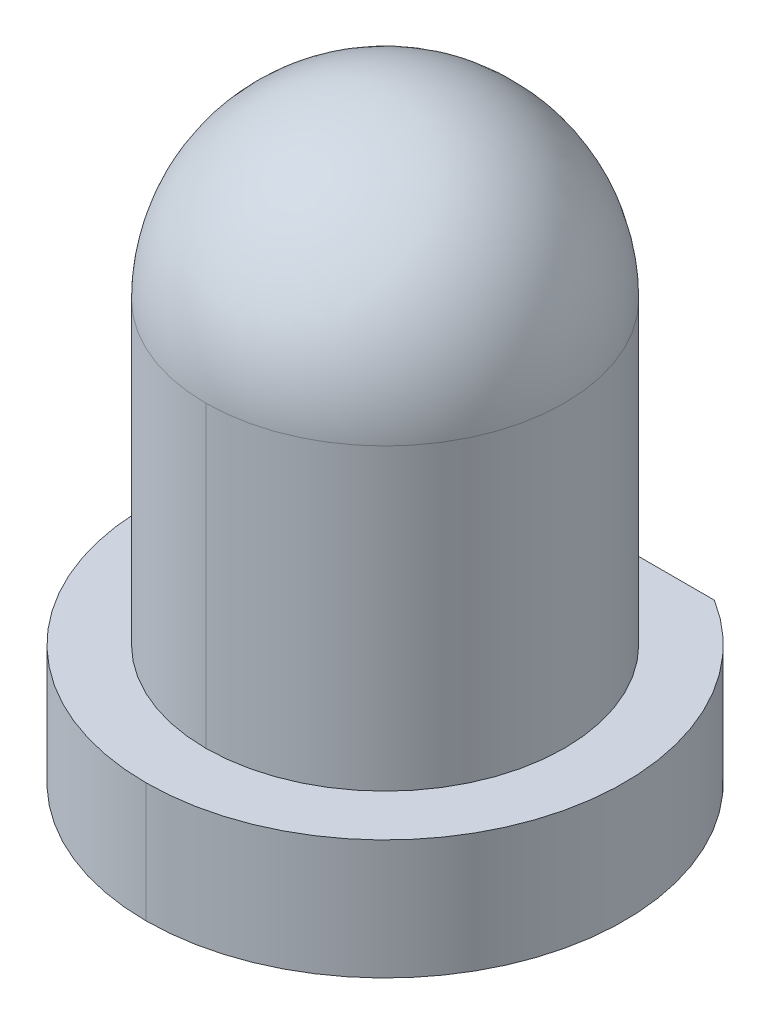
ISO-10303-21;
HEADER;
FILE_DESCRIPTION(('STEP AP214'),'2;1');
FILE_NAME('part.step','',(''),(''),'','','');
FILE_SCHEMA(('AUTOMOTIVE_DESIGN { 1 0 10303 214 1 1 1 1 }'));
ENDSEC;
DATA;
#1=APPLICATION_CONTEXT('core data for automotive mechanical design processes');
#2=APPLICATION_PROTOCOL_DEFINITION('international standard','automotive_design',2000,#1);
#3=PRODUCT_CONTEXT('',#1,'mechanical');
#4=PRODUCT('Part','Part','',(#3));
#5=PRODUCT_RELATED_PRODUCT_CATEGORY('part','',(#4));
#6=PRODUCT_DEFINITION_FORMATION('','',#4);
#7=PRODUCT_DEFINITION_CONTEXT('part definition',#1,'design');
#8=PRODUCT_DEFINITION('design','',#6,#7);
#9=PRODUCT_DEFINITION_SHAPE('','',#8);
#10=(LENGTH_UNIT() NAMED_UNIT(*) SI_UNIT(.MILLI.,.METRE.));
#11=(NAMED_UNIT(*) PLANE_ANGLE_UNIT() SI_UNIT($,.RADIAN.));
#12=(NAMED_UNIT(*) SI_UNIT($,.STERADIAN.) SOLID_ANGLE_UNIT());
#13=UNCERTAINTY_MEASURE_WITH_UNIT(LENGTH_MEASURE(1.E-05),#10,'distance_accuracy_value','');
#14=(GEOMETRIC_REPRESENTATION_CONTEXT(3) GLOBAL_UNCERTAINTY_ASSIGNED_CONTEXT((#13)) GLOBAL_UNIT_ASSIGNED_CONTEXT((#10,
#11,#12)) REPRESENTATION_CONTEXT('',''));
#15=CARTESIAN_POINT('',(0.,0.,0.));
#16=DIRECTION('',(0.,0.,1.));
#17=DIRECTION('',(1.,0.,0.));
#18=AXIS2_PLACEMENT_3D('',#15,#16,#17);
#19=CARTESIAN_POINT('',(0.,0.1,0.));
#20=DIRECTION('',(0.,-1.,0.));
#21=DIRECTION('',(0.,0.,-1.));
#22=AXIS2_PLACEMENT_3D('',#19,#20,#21);
#23=PLANE('',#22);
#24=DIRECTION('',(1.,0.,0.));
#25=VECTOR('',#24,1.);
#26=CARTESIAN_POINT('',(-1.25,0.1,-0.25));
#27=LINE('',#26,#25);
#28=CARTESIAN_POINT('',(-1.25,0.1,-0.25));
#29=VERTEX_POINT('',#28);
#30=CARTESIAN_POINT('',(-0.75,0.1,-0.25));
#31=VERTEX_POINT('',#30);
#32=EDGE_CURVE('E293',#29,#31,#27,.T.);
#33=ORIENTED_EDGE('',*,*,#32,.T.);
#34=DIRECTION('',(0.,0.,1.));
#35=VECTOR('',#34,1.);
#36=CARTESIAN_POINT('',(-0.75,0.1,-0.25));
#37=LINE('',#36,#35);
#38=CARTESIAN_POINT('',(-0.75,0.1,0.25));
#39=VERTEX_POINT('',#38);
#40=EDGE_CURVE('E266',#31,#39,#37,.T.);
#41=ORIENTED_EDGE('',*,*,#40,.T.);
#42=DIRECTION('',(-1.,0.,0.));
#43=VECTOR('',#42,1.);
#44=CARTESIAN_POINT('',(-0.75,0.1,0.25));
#45=LINE('',#44,#43);
#46=CARTESIAN_POINT('',(-1.25,0.1,0.25));
#47=VERTEX_POINT('',#46);
#48=EDGE_CURVE('E261',#39,#47,#45,.T.);
#49=ORIENTED_EDGE('',*,*,#48,.T.);
#50=DIRECTION('',(0.,0.,-1.));
#51=VECTOR('',#50,1.);
#52=CARTESIAN_POINT('',(-1.25,0.1,0.25));
#53=LINE('',#52,#51);
#54=EDGE_CURVE('E11',#47,#29,#53,.T.);
#55=ORIENTED_EDGE('',*,*,#54,.T.);
#56=EDGE_LOOP('',(#33,#41,#49,#55));
#57=FACE_BOUND('',#56,.T.);
#58=ADVANCED_FACE('F16',(#57),#23,.T.);
#59=CARTESIAN_POINT('',(0.,0.1,0.));
#60=DIRECTION('',(0.,-1.,0.));
#61=DIRECTION('',(0.,0.,-1.));
#62=AXIS2_PLACEMENT_3D('',#59,#60,#61);
#63=PLANE('',#62);
#64=DIRECTION('',(1.,0.,0.));
#65=VECTOR('',#64,1.);
#66=CARTESIAN_POINT('',(-0.25,0.1,-0.25));
#67=LINE('',#66,#65);
#68=CARTESIAN_POINT('',(-0.25,0.1,-0.25));
#69=VERTEX_POINT('',#68);
#70=CARTESIAN_POINT('',(0.25,0.1,-0.25));
#71=VERTEX_POINT('',#70);
#72=EDGE_CURVE('E310',#69,#71,#67,.T.);
#73=ORIENTED_EDGE('',*,*,#72,.T.);
#74=DIRECTION('',(0.,0.,1.));
#75=VECTOR('',#74,1.);
#76=CARTESIAN_POINT('',(0.25,0.1,-0.25));
#77=LINE('',#76,#75);
#78=CARTESIAN_POINT('',(0.25,0.1,0.25));
#79=VERTEX_POINT('',#78);
#80=EDGE_CURVE('E324',#71,#79,#77,.T.);
#81=ORIENTED_EDGE('',*,*,#80,.T.);
#82=DIRECTION('',(-1.,0.,0.));
#83=VECTOR('',#82,1.);
#84=CARTESIAN_POINT('',(0.25,0.1,0.25));
#85=LINE('',#84,#83);
#86=CARTESIAN_POINT('',(-0.25,0.1,0.25));
#87=VERTEX_POINT('',#86);
#88=EDGE_CURVE('E259',#79,#87,#85,.T.);
#89=ORIENTED_EDGE('',*,*,#88,.T.);
#90=DIRECTION('',(0.,0.,-1.));
#91=VECTOR('',#90,1.);
#92=CARTESIAN_POINT('',(-0.25,0.1,0.25));
#93=LINE('',#92,#91);
#94=EDGE_CURVE('E322',#87,#69,#93,.T.);
#95=ORIENTED_EDGE('',*,*,#94,.T.);
#96=EDGE_LOOP('',(#73,#81,#89,#95));
#97=FACE_BOUND('',#96,.T.);
#98=ADVANCED_FACE('F509',(#97),#63,.T.);
#99=CARTESIAN_POINT('',(0.,0.1,0.));
#100=DIRECTION('',(0.,-1.,0.));
#101=DIRECTION('',(0.,0.,-1.));
#102=AXIS2_PLACEMENT_3D('',#99,#100,#101);
#103=PLANE('',#102);
#104=DIRECTION('',(1.,0.,0.));
#105=VECTOR('',#104,1.);
#106=CARTESIAN_POINT('',(0.75,0.1,-0.25));
#107=LINE('',#106,#105);
#108=CARTESIAN_POINT('',(0.75,0.1,-0.25));
#109=VERTEX_POINT('',#108);
#110=CARTESIAN_POINT('',(1.25,0.1,-0.25));
#111=VERTEX_POINT('',#110);
#112=EDGE_CURVE('E210',#109,#111,#107,.T.);
#113=ORIENTED_EDGE('',*,*,#112,.T.);
#114=DIRECTION('',(0.,0.,1.));
#115=VECTOR('',#114,1.);
#116=CARTESIAN_POINT('',(1.25,0.1,-0.25));
#117=LINE('',#116,#115);
#118=CARTESIAN_POINT('',(1.25,0.1,0.25));
#119=VERTEX_POINT('',#118);
#120=EDGE_CURVE('E291',#111,#119,#117,.T.);
#121=ORIENTED_EDGE('',*,*,#120,.T.);
#122=DIRECTION('',(-1.,0.,0.));
#123=VECTOR('',#122,1.);
#124=CARTESIAN_POINT('',(1.25,0.1,0.25));
#125=LINE('',#124,#123);
#126=CARTESIAN_POINT('',(0.75,0.1,0.25));
#127=VERTEX_POINT('',#126);
#128=EDGE_CURVE('E292',#119,#127,#125,.T.);
#129=ORIENTED_EDGE('',*,*,#128,.T.);
#130=DIRECTION('',(0.,0.,-1.));
#131=VECTOR('',#130,1.);
#132=CARTESIAN_POINT('',(0.75,0.1,0.25));
#133=LINE('',#132,#131);
#134=EDGE_CURVE('E260',#127,#109,#133,.T.);
#135=ORIENTED_EDGE('',*,*,#134,.T.);
#136=EDGE_LOOP('',(#113,#121,#129,#135));
#137=FACE_BOUND('',#136,.T.);
#138=ADVANCED_FACE('F500',(#137),#103,.T.);
#139=CARTESIAN_POINT('',(-1.25,0.1,0.25));
#140=DIRECTION('',(-1.,0.,0.));
#141=DIRECTION('',(0.,0.,1.));
#142=AXIS2_PLACEMENT_3D('',#139,#140,#141);
#143=PLANE('',#142);
#144=DIRECTION('',(0.,1.,0.));
#145=VECTOR('',#144,1.);
#146=CARTESIAN_POINT('',(-1.25,0.1,-0.25));
#147=LINE('',#146,#145);
#148=CARTESIAN_POINT('',(-1.25,0.,-0.25));
#149=VERTEX_POINT('',#148);
#150=EDGE_CURVE('E26',#149,#29,#147,.T.);
#151=ORIENTED_EDGE('',*,*,#150,.T.);
#152=ORIENTED_EDGE('',*,*,#54,.F.);
#153=DIRECTION('',(0.,-1.,0.));
#154=VECTOR('',#153,1.);
#155=CARTESIAN_POINT('',(-1.25,0.1,0.25));
#156=LINE('',#155,#154);
#157=CARTESIAN_POINT('',(-1.25,0.,0.25));
#158=VERTEX_POINT('',#157);
#159=EDGE_CURVE('E265',#47,#158,#156,.T.);
#160=ORIENTED_EDGE('',*,*,#159,.T.);
#161=DIRECTION('',(0.,0.,-1.));
#162=VECTOR('',#161,1.);
#163=CARTESIAN_POINT('',(-1.25,0.,0.));
#164=LINE('',#163,#162);
#165=EDGE_CURVE('E270',#158,#149,#164,.T.);
#166=ORIENTED_EDGE('',*,*,#165,.T.);
#167=EDGE_LOOP('',(#151,#152,#160,#166));
#168=FACE_BOUND('',#167,.T.);
#169=ADVANCED_FACE('F385',(#168),#143,.F.);
#170=CARTESIAN_POINT('',(-1.25,0.1,-0.25));
#171=DIRECTION('',(0.,0.,-1.));
#172=DIRECTION('',(0.,-1.,0.));
#173=AXIS2_PLACEMENT_3D('',#170,#171,#172);
#174=PLANE('',#173);
#175=DIRECTION('',(0.,1.,0.));
#176=VECTOR('',#175,1.);
#177=CARTESIAN_POINT('',(-0.75,0.1,-0.25));
#178=LINE('',#177,#176);
#179=CARTESIAN_POINT('',(-0.75,0.,-0.25));
#180=VERTEX_POINT('',#179);
#181=EDGE_CURVE('E269',#180,#31,#178,.T.);
#182=ORIENTED_EDGE('',*,*,#181,.T.);
#183=ORIENTED_EDGE('',*,*,#32,.F.);
#184=ORIENTED_EDGE('',*,*,#150,.F.);
#185=DIRECTION('',(1.,0.,0.));
#186=VECTOR('',#185,1.);
#187=CARTESIAN_POINT('',(0.,0.,-0.25));
#188=LINE('',#187,#186);
#189=EDGE_CURVE('E275',#149,#180,#188,.T.);
#190=ORIENTED_EDGE('',*,*,#189,.T.);
#191=EDGE_LOOP('',(#182,#183,#184,#190));
#192=FACE_BOUND('',#191,.T.);
#193=ADVANCED_FACE('F397',(#192),#174,.F.);
#194=CARTESIAN_POINT('',(-0.75,0.1,-0.25));
#195=DIRECTION('',(1.,0.,0.));
#196=DIRECTION('',(0.,1.,0.));
#197=AXIS2_PLACEMENT_3D('',#194,#195,#196);
#198=PLANE('',#197);
#199=DIRECTION('',(0.,1.,0.));
#200=VECTOR('',#199,1.);
#201=CARTESIAN_POINT('',(-0.75,0.1,0.25));
#202=LINE('',#201,#200);
#203=CARTESIAN_POINT('',(-0.75,0.,0.25));
#204=VERTEX_POINT('',#203);
#205=EDGE_CURVE('E264',#204,#39,#202,.T.);
#206=ORIENTED_EDGE('',*,*,#205,.T.);
#207=ORIENTED_EDGE('',*,*,#40,.F.);
#208=ORIENTED_EDGE('',*,*,#181,.F.);
#209=DIRECTION('',(0.,0.,1.));
#210=VECTOR('',#209,1.);
#211=CARTESIAN_POINT('',(-0.75,0.,0.));
#212=LINE('',#211,#210);
#213=EDGE_CURVE('E296',#180,#204,#212,.T.);
#214=ORIENTED_EDGE('',*,*,#213,.T.);
#215=EDGE_LOOP('',(#206,#207,#208,#214));
#216=FACE_BOUND('',#215,.T.);
#217=ADVANCED_FACE('F570',(#216),#198,.F.);
#218=CARTESIAN_POINT('',(-0.75,0.1,0.25));
#219=DIRECTION('',(0.,0.,1.));
#220=DIRECTION('',(1.,0.,0.));
#221=AXIS2_PLACEMENT_3D('',#218,#219,#220);
#222=PLANE('',#221);
#223=ORIENTED_EDGE('',*,*,#159,.F.);
#224=ORIENTED_EDGE('',*,*,#48,.F.);
#225=ORIENTED_EDGE('',*,*,#205,.F.);
#226=DIRECTION('',(-1.,0.,0.));
#227=VECTOR('',#226,1.);
#228=CARTESIAN_POINT('',(0.,0.,0.25));
#229=LINE('',#228,#227);
#230=EDGE_CURVE('E274',#204,#158,#229,.T.);
#231=ORIENTED_EDGE('',*,*,#230,.T.);
#232=EDGE_LOOP('',(#223,#224,#225,#231));
#233=FACE_BOUND('',#232,.T.);
#234=ADVANCED_FACE('F391',(#233),#222,.F.);
#235=CARTESIAN_POINT('',(-0.25,0.1,0.25));
#236=DIRECTION('',(-1.,0.,0.));
#237=DIRECTION('',(0.,0.,1.));
#238=AXIS2_PLACEMENT_3D('',#235,#236,#237);
#239=PLANE('',#238);
#240=DIRECTION('',(0.,1.,0.));
#241=VECTOR('',#240,1.);
#242=CARTESIAN_POINT('',(-0.25,0.1,-0.25));
#243=LINE('',#242,#241);
#244=CARTESIAN_POINT('',(-0.25,0.,-0.25));
#245=VERTEX_POINT('',#244);
#246=EDGE_CURVE('E312',#245,#69,#243,.T.);
#247=ORIENTED_EDGE('',*,*,#246,.T.);
#248=ORIENTED_EDGE('',*,*,#94,.F.);
#249=DIRECTION('',(0.,-1.,0.));
#250=VECTOR('',#249,1.);
#251=CARTESIAN_POINT('',(-0.25,0.1,0.25));
#252=LINE('',#251,#250);
#253=CARTESIAN_POINT('',(-0.25,0.,0.25));
#254=VERTEX_POINT('',#253);
#255=EDGE_CURVE('E256',#87,#254,#252,.T.);
#256=ORIENTED_EDGE('',*,*,#255,.T.);
#257=DIRECTION('',(0.,0.,-1.));
#258=VECTOR('',#257,1.);
#259=CARTESIAN_POINT('',(-0.25,0.,0.));
#260=LINE('',#259,#258);
#261=EDGE_CURVE('E377',#254,#245,#260,.T.);
#262=ORIENTED_EDGE('',*,*,#261,.T.);
#263=EDGE_LOOP('',(#247,#248,#256,#262));
#264=FACE_BOUND('',#263,.T.);
#265=ADVANCED_FACE('F18',(#264),#239,.F.);
#266=CARTESIAN_POINT('',(-0.25,0.1,-0.25));
#267=DIRECTION('',(0.,0.,-1.));
#268=DIRECTION('',(0.,-1.,0.));
#269=AXIS2_PLACEMENT_3D('',#266,#267,#268);
#270=PLANE('',#269);
#271=DIRECTION('',(0.,1.,0.));
#272=VECTOR('',#271,1.);
#273=CARTESIAN_POINT('',(0.25,0.1,-0.25));
#274=LINE('',#273,#272);
#275=CARTESIAN_POINT('',(0.25,0.,-0.25));
#276=VERTEX_POINT('',#275);
#277=EDGE_CURVE('E313',#276,#71,#274,.T.);
#278=ORIENTED_EDGE('',*,*,#277,.T.);
#279=ORIENTED_EDGE('',*,*,#72,.F.);
#280=ORIENTED_EDGE('',*,*,#246,.F.);
#281=DIRECTION('',(1.,0.,0.));
#282=VECTOR('',#281,1.);
#283=CARTESIAN_POINT('',(0.,0.,-0.25));
#284=LINE('',#283,#282);
#285=EDGE_CURVE('E286',#245,#276,#284,.T.);
#286=ORIENTED_EDGE('',*,*,#285,.T.);
#287=EDGE_LOOP('',(#278,#279,#280,#286));
#288=FACE_BOUND('',#287,.T.);
#289=ADVANCED_FACE('F612',(#288),#270,.F.);
#290=CARTESIAN_POINT('',(0.25,0.1,-0.25));
#291=DIRECTION('',(1.,0.,0.));
#292=DIRECTION('',(0.,1.,0.));
#293=AXIS2_PLACEMENT_3D('',#290,#291,#292);
#294=PLANE('',#293);
#295=DIRECTION('',(0.,1.,0.));
#296=VECTOR('',#295,1.);
#297=CARTESIAN_POINT('',(0.25,0.1,0.25));
#298=LINE('',#297,#296);
#299=CARTESIAN_POINT('',(0.25,0.,0.25));
#300=VERTEX_POINT('',#299);
#301=EDGE_CURVE('E309',#300,#79,#298,.T.);
#302=ORIENTED_EDGE('',*,*,#301,.T.);
#303=ORIENTED_EDGE('',*,*,#80,.F.);
#304=ORIENTED_EDGE('',*,*,#277,.F.);
#305=DIRECTION('',(0.,0.,1.));
#306=VECTOR('',#305,1.);
#307=CARTESIAN_POINT('',(0.25,0.,0.));
#308=LINE('',#307,#306);
#309=EDGE_CURVE('E279',#276,#300,#308,.T.);
#310=ORIENTED_EDGE('',*,*,#309,.T.);
#311=EDGE_LOOP('',(#302,#303,#304,#310));
#312=FACE_BOUND('',#311,.T.);
#313=ADVANCED_FACE('F541',(#312),#294,.F.);
#314=CARTESIAN_POINT('',(0.25,0.1,0.25));
#315=DIRECTION('',(0.,0.,1.));
#316=DIRECTION('',(1.,0.,0.));
#317=AXIS2_PLACEMENT_3D('',#314,#315,#316);
#318=PLANE('',#317);
#319=ORIENTED_EDGE('',*,*,#255,.F.);
#320=ORIENTED_EDGE('',*,*,#88,.F.);
#321=ORIENTED_EDGE('',*,*,#301,.F.);
#322=DIRECTION('',(-1.,0.,0.));
#323=VECTOR('',#322,1.);
#324=CARTESIAN_POINT('',(0.,0.,0.25));
#325=LINE('',#324,#323);
#326=EDGE_CURVE('E249',#300,#254,#325,.T.);
#327=ORIENTED_EDGE('',*,*,#326,.T.);
#328=EDGE_LOOP('',(#319,#320,#321,#327));
#329=FACE_BOUND('',#328,.T.);
#330=ADVANCED_FACE('F535',(#329),#318,.F.);
#331=CARTESIAN_POINT('',(0.75,0.1,0.25));
#332=DIRECTION('',(-1.,0.,0.));
#333=DIRECTION('',(0.,0.,1.));
#334=AXIS2_PLACEMENT_3D('',#331,#332,#333);
#335=PLANE('',#334);
#336=DIRECTION('',(0.,1.,0.));
#337=VECTOR('',#336,1.);
#338=CARTESIAN_POINT('',(0.75,0.1,-0.25));
#339=LINE('',#338,#337);
#340=CARTESIAN_POINT('',(0.75,0.,-0.25));
#341=VERTEX_POINT('',#340);
#342=EDGE_CURVE('E213',#341,#109,#339,.T.);
#343=ORIENTED_EDGE('',*,*,#342,.T.);
#344=ORIENTED_EDGE('',*,*,#134,.F.);
#345=DIRECTION('',(0.,-1.,0.));
#346=VECTOR('',#345,1.);
#347=CARTESIAN_POINT('',(0.75,0.1,0.25));
#348=LINE('',#347,#346);
#349=CARTESIAN_POINT('',(0.75,0.,0.25));
#350=VERTEX_POINT('',#349);
#351=EDGE_CURVE('E302',#127,#350,#348,.T.);
#352=ORIENTED_EDGE('',*,*,#351,.T.);
#353=DIRECTION('',(0.,0.,-1.));
#354=VECTOR('',#353,1.);
#355=CARTESIAN_POINT('',(0.75,0.,0.));
#356=LINE('',#355,#354);
#357=EDGE_CURVE('E221',#350,#341,#356,.T.);
#358=ORIENTED_EDGE('',*,*,#357,.T.);
#359=EDGE_LOOP('',(#343,#344,#352,#358));
#360=FACE_BOUND('',#359,.T.);
#361=ADVANCED_FACE('F540',(#360),#335,.F.);
#362=CARTESIAN_POINT('',(0.75,0.1,-0.25));
#363=DIRECTION('',(0.,0.,-1.));
#364=DIRECTION('',(0.,-1.,0.));
#365=AXIS2_PLACEMENT_3D('',#362,#363,#364);
#366=PLANE('',#365);
#367=DIRECTION('',(0.,1.,0.));
#368=VECTOR('',#367,1.);
#369=CARTESIAN_POINT('',(1.25,0.1,-0.25));
#370=LINE('',#369,#368);
#371=CARTESIAN_POINT('',(1.25,0.,-0.25));
#372=VERTEX_POINT('',#371);
#373=EDGE_CURVE('E214',#372,#111,#370,.T.);
#374=ORIENTED_EDGE('',*,*,#373,.T.);
#375=ORIENTED_EDGE('',*,*,#112,.F.);
#376=ORIENTED_EDGE('',*,*,#342,.F.);
#377=DIRECTION('',(1.,0.,0.));
#378=VECTOR('',#377,1.);
#379=CARTESIAN_POINT('',(0.,0.,-0.25));
#380=LINE('',#379,#378);
#381=EDGE_CURVE('E225',#341,#372,#380,.T.);
#382=ORIENTED_EDGE('',*,*,#381,.T.);
#383=EDGE_LOOP('',(#374,#375,#376,#382));
#384=FACE_BOUND('',#383,.T.);
#385=ADVANCED_FACE('F592',(#384),#366,.F.);
#386=CARTESIAN_POINT('',(1.25,0.1,-0.25));
#387=DIRECTION('',(1.,0.,0.));
#388=DIRECTION('',(0.,1.,0.));
#389=AXIS2_PLACEMENT_3D('',#386,#387,#388);
#390=PLANE('',#389);
#391=DIRECTION('',(0.,1.,0.));
#392=VECTOR('',#391,1.);
#393=CARTESIAN_POINT('',(1.25,0.1,0.25));
#394=LINE('',#393,#392);
#395=CARTESIAN_POINT('',(1.25,0.,0.25));
#396=VERTEX_POINT('',#395);
#397=EDGE_CURVE('E287',#396,#119,#394,.T.);
#398=ORIENTED_EDGE('',*,*,#397,.T.);
#399=ORIENTED_EDGE('',*,*,#120,.F.);
#400=ORIENTED_EDGE('',*,*,#373,.F.);
#401=DIRECTION('',(0.,0.,1.));
#402=VECTOR('',#401,1.);
#403=CARTESIAN_POINT('',(1.25,0.,0.));
#404=LINE('',#403,#402);
#405=EDGE_CURVE('E238',#372,#396,#404,.T.);
#406=ORIENTED_EDGE('',*,*,#405,.T.);
#407=EDGE_LOOP('',(#398,#399,#400,#406));
#408=FACE_BOUND('',#407,.T.);
#409=ADVANCED_FACE('F553',(#408),#390,.F.);
#410=CARTESIAN_POINT('',(1.25,0.1,0.25));
#411=DIRECTION('',(0.,0.,1.));
#412=DIRECTION('',(1.,0.,0.));
#413=AXIS2_PLACEMENT_3D('',#410,#411,#412);
#414=PLANE('',#413);
#415=ORIENTED_EDGE('',*,*,#351,.F.);
#416=ORIENTED_EDGE('',*,*,#128,.F.);
#417=ORIENTED_EDGE('',*,*,#397,.F.);
#418=DIRECTION('',(-1.,0.,0.));
#419=VECTOR('',#418,1.);
#420=CARTESIAN_POINT('',(0.,0.,0.25));
#421=LINE('',#420,#419);
#422=EDGE_CURVE('E224',#396,#350,#421,.T.);
#423=ORIENTED_EDGE('',*,*,#422,.T.);
#424=EDGE_LOOP('',(#415,#416,#417,#423));
#425=FACE_BOUND('',#424,.T.);
#426=ADVANCED_FACE('F548',(#425),#414,.F.);
#427=CARTESIAN_POINT('',(0.,0.,0.));
#428=DIRECTION('',(0.,1.,0.));
#429=DIRECTION('',(1.,0.,0.));
#430=AXIS2_PLACEMENT_3D('',#427,#428,#429);
#431=PLANE('',#430);
#432=CARTESIAN_POINT('',(0.,0.,0.));
#433=DIRECTION('',(0.,1.,0.));
#434=DIRECTION('',(0.,0.,1.));
#435=AXIS2_PLACEMENT_3D('',#432,#433,#434);
#436=CIRCLE('',#435,2.);
#437=CARTESIAN_POINT('',(-1.053565375285,0.,-1.7));
#438=VERTEX_POINT('',#437);
#439=CARTESIAN_POINT('',(0.,0.,2.));
#440=VERTEX_POINT('',#439);
#441=EDGE_CURVE('E255',#438,#440,#436,.T.);
#442=ORIENTED_EDGE('',*,*,#441,.F.);
#443=DIRECTION('',(1.,0.,0.));
#444=VECTOR('',#443,1.);
#445=CARTESIAN_POINT('',(-1.053565375285,0.,-1.7));
#446=LINE('',#445,#444);
#447=CARTESIAN_POINT('',(1.053565375285,0.,-1.7));
#448=VERTEX_POINT('',#447);
#449=EDGE_CURVE('E228',#438,#448,#446,.T.);
#450=ORIENTED_EDGE('',*,*,#449,.T.);
#451=CARTESIAN_POINT('',(0.,0.,0.));
#452=DIRECTION('',(0.,1.,0.));
#453=DIRECTION('',(0.,0.,1.));
#454=AXIS2_PLACEMENT_3D('',#451,#452,#453);
#455=CIRCLE('',#454,2.);
#456=EDGE_CURVE('E229',#440,#448,#455,.T.);
#457=ORIENTED_EDGE('',*,*,#456,.F.);
#458=EDGE_LOOP('',(#442,#450,#457));
#459=FACE_BOUND('',#458,.T.);
#460=ORIENTED_EDGE('',*,*,#213,.F.);
#461=ORIENTED_EDGE('',*,*,#189,.F.);
#462=ORIENTED_EDGE('',*,*,#165,.F.);
#463=ORIENTED_EDGE('',*,*,#230,.F.);
#464=EDGE_LOOP('',(#460,#461,#462,#463));
#465=FACE_BOUND('',#464,.T.);
#466=ORIENTED_EDGE('',*,*,#309,.F.);
#467=ORIENTED_EDGE('',*,*,#285,.F.);
#468=ORIENTED_EDGE('',*,*,#261,.F.);
#469=ORIENTED_EDGE('',*,*,#326,.F.);
#470=EDGE_LOOP('',(#466,#467,#468,#469));
#471=FACE_BOUND('',#470,.T.);
#472=ORIENTED_EDGE('',*,*,#405,.F.);
#473=ORIENTED_EDGE('',*,*,#381,.F.);
#474=ORIENTED_EDGE('',*,*,#357,.F.);
#475=ORIENTED_EDGE('',*,*,#422,.F.);
#476=EDGE_LOOP('',(#472,#473,#474,#475));
#477=FACE_BOUND('',#476,.T.);
#478=ADVANCED_FACE('F394',(#459,#465,#471,#477),#431,.F.);
#479=CARTESIAN_POINT('',(-1.053565375285,-2.,-1.7));
#480=DIRECTION('',(0.,0.,1.));
#481=DIRECTION('',(1.,0.,0.));
#482=AXIS2_PLACEMENT_3D('',#479,#480,#481);
#483=PLANE('',#482);
#484=DIRECTION('',(0.,1.,0.));
#485=VECTOR('',#484,1.);
#486=CARTESIAN_POINT('',(1.053565375285,0.,-1.7));
#487=LINE('',#486,#485);
#488=CARTESIAN_POINT('',(1.053565375285,1.,-1.7));
#489=VERTEX_POINT('',#488);
#490=EDGE_CURVE('E226',#448,#489,#487,.T.);
#491=ORIENTED_EDGE('',*,*,#490,.F.);
#492=ORIENTED_EDGE('',*,*,#449,.F.);
#493=DIRECTION('',(0.,-1.,0.));
#494=VECTOR('',#493,1.);
#495=CARTESIAN_POINT('',(-1.053565375285,0.,-1.7));
#496=LINE('',#495,#494);
#497=CARTESIAN_POINT('',(-1.053565375285,1.,-1.7));
#498=VERTEX_POINT('',#497);
#499=EDGE_CURVE('E215',#498,#438,#496,.T.);
#500=ORIENTED_EDGE('',*,*,#499,.F.);
#501=DIRECTION('',(-1.,0.,0.));
#502=VECTOR('',#501,1.);
#503=CARTESIAN_POINT('',(0.,1.,-1.7));
#504=LINE('',#503,#502);
#505=EDGE_CURVE('E186',#489,#498,#504,.T.);
#506=ORIENTED_EDGE('',*,*,#505,.F.);
#507=EDGE_LOOP('',(#491,#492,#500,#506));
#508=FACE_BOUND('',#507,.T.);
#509=ADVANCED_FACE('F530',(#508),#483,.F.);
#510=CARTESIAN_POINT('',(0.,0.,0.));
#511=DIRECTION('',(0.,1.,0.));
#512=DIRECTION('',(0.,0.,1.));
#513=AXIS2_PLACEMENT_3D('',#510,#511,#512);
#514=CYLINDRICAL_SURFACE('',#513,2.);
#515=DIRECTION('',(0.,1.,0.));
#516=VECTOR('',#515,1.);
#517=CARTESIAN_POINT('',(0.,0.,2.));
#518=LINE('',#517,#516);
#519=CARTESIAN_POINT('',(0.,1.,2.));
#520=VERTEX_POINT('',#519);
#521=EDGE_CURVE('E251',#440,#520,#518,.T.);
#522=ORIENTED_EDGE('',*,*,#521,.F.);
#523=ORIENTED_EDGE('',*,*,#456,.T.);
#524=ORIENTED_EDGE('',*,*,#490,.T.);
#525=CARTESIAN_POINT('',(0.,1.,0.));
#526=DIRECTION('',(0.,1.,0.));
#527=DIRECTION('',(0.,0.,1.));
#528=AXIS2_PLACEMENT_3D('',#525,#526,#527);
#529=CIRCLE('',#528,2.);
#530=EDGE_CURVE('E240',#520,#489,#529,.T.);
#531=ORIENTED_EDGE('',*,*,#530,.F.);
#532=EDGE_LOOP('',(#522,#523,#524,#531));
#533=FACE_BOUND('',#532,.T.);
#534=ADVANCED_FACE('F525',(#533),#514,.T.);
#535=CARTESIAN_POINT('',(1.5,3.5,0.));
#536=CARTESIAN_POINT('',(1.5,3.5,0.));
#537=CARTESIAN_POINT('',(1.5,3.5,0.));
#538=CARTESIAN_POINT('',(1.5,3.5,0.));
#539=CARTESIAN_POINT('',(1.5,3.5,-3.));
#540=CARTESIAN_POINT('',(1.5,9.5,-3.));
#541=CARTESIAN_POINT('',(1.5,9.5,3.));
#542=CARTESIAN_POINT('',(1.5,3.5,3.));
#543=CARTESIAN_POINT('',(-1.5,3.5,-3.));
#544=CARTESIAN_POINT('',(-1.5,9.5,-3.));
#545=CARTESIAN_POINT('',(-1.5,9.5,3.));
#546=CARTESIAN_POINT('',(-1.5,3.5,3.));
#547=CARTESIAN_POINT('',(-1.5,3.5,0.));
#548=CARTESIAN_POINT('',(-1.5,3.5,0.));
#549=CARTESIAN_POINT('',(-1.5,3.5,0.));
#550=CARTESIAN_POINT('',(-1.5,3.5,0.));
#551=(BOUNDED_SURFACE() B_SPLINE_SURFACE(3,3,((#535,#536,#537,#538),(#539,#540,#541,#542),(#543,
#544,#545,#546),(#547,#548,#549,#550)),.UNSPECIFIED.,.F.,.F.,
.F.) B_SPLINE_SURFACE_WITH_KNOTS((4,4),(4,4),(0.,1.),(0.,1.),
.UNSPECIFIED.) GEOMETRIC_REPRESENTATION_ITEM() RATIONAL_B_SPLINE_SURFACE(((1.,0.333333333333,
0.333333333333,1.),(0.333333333333,0.111111111111,0.111111111111,0.333333333333),
(0.333333333333,0.111111111111,0.111111111111,0.333333333333),(1.,0.333333333333,0.333333333333,1.))) REPRESENTATION_ITEM('') SURFACE());
#552=CARTESIAN_POINT('',(0.,3.5,0.));
#553=DIRECTION('',(0.,-1.,0.));
#554=DIRECTION('',(0.,0.,1.));
#555=AXIS2_PLACEMENT_3D('',#552,#553,#554);
#556=CIRCLE('',#555,1.5);
#557=CARTESIAN_POINT('',(-1.5,3.5,0.));
#558=VERTEX_POINT('',#557);
#559=CARTESIAN_POINT('',(0.,3.5,-1.5));
#560=VERTEX_POINT('',#559);
#561=EDGE_CURVE('E175',#558,#560,#556,.T.);
#562=CARTESIAN_POINT('',(0.,3.5,0.));
#563=DIRECTION('',(0.,-1.,0.));
#564=DIRECTION('',(0.,0.,1.));
#565=AXIS2_PLACEMENT_3D('',#562,#563,#564);
#566=CIRCLE('',#565,1.5);
#567=CARTESIAN_POINT('',(0.,3.5,1.5));
#568=VERTEX_POINT('',#567);
#569=EDGE_CURVE('E183',#568,#558,#566,.T.);
#570=CARTESIAN_POINT('',(0.,3.5,0.));
#571=DIRECTION('',(0.,-1.,0.));
#572=DIRECTION('',(0.,0.,1.));
#573=AXIS2_PLACEMENT_3D('',#570,#571,#572);
#574=CIRCLE('',#573,1.5);
#575=CARTESIAN_POINT('',(1.5,3.5,0.));
#576=VERTEX_POINT('',#575);
#577=EDGE_CURVE('E192',#576,#568,#574,.T.);
#578=CARTESIAN_POINT('',(0.,3.5,0.));
#579=DIRECTION('',(0.,-1.,0.));
#580=DIRECTION('',(0.,0.,1.));
#581=AXIS2_PLACEMENT_3D('',#578,#579,#580);
#582=CIRCLE('',#581,1.5);
#583=EDGE_CURVE('E189',#560,#576,#582,.T.);
#584=ORIENTED_EDGE('',*,*,#561,.F.);
#585=ORIENTED_EDGE('',*,*,#569,.F.);
#586=ORIENTED_EDGE('',*,*,#577,.F.);
#587=ORIENTED_EDGE('',*,*,#583,.F.);
#588=EDGE_LOOP('',(#584,#585,#586,#587));
#589=FACE_BOUND('',#588,.T.);
#590=ADVANCED_FACE('F190',(#589),#551,.T.);
#591=CARTESIAN_POINT('',(0.,1.,0.));
#592=DIRECTION('',(0.,1.,0.));
#593=DIRECTION('',(1.,0.,0.));
#594=AXIS2_PLACEMENT_3D('',#591,#592,#593);
#595=PLANE('',#594);
#596=ORIENTED_EDGE('',*,*,#505,.T.);
#597=CARTESIAN_POINT('',(0.,1.,0.));
#598=DIRECTION('',(0.,1.,0.));
#599=DIRECTION('',(0.,0.,1.));
#600=AXIS2_PLACEMENT_3D('',#597,#598,#599);
#601=CIRCLE('',#600,2.);
#602=EDGE_CURVE('E220',#498,#520,#601,.T.);
#603=ORIENTED_EDGE('',*,*,#602,.T.);
#604=ORIENTED_EDGE('',*,*,#530,.T.);
#605=EDGE_LOOP('',(#596,#603,#604));
#606=FACE_BOUND('',#605,.T.);
#607=CARTESIAN_POINT('',(0.,1.,0.));
#608=DIRECTION('',(0.,1.,0.));
#609=DIRECTION('',(0.,0.,1.));
#610=AXIS2_PLACEMENT_3D('',#607,#608,#609);
#611=CIRCLE('',#610,1.5);
#612=CARTESIAN_POINT('',(0.,1.,1.5));
#613=VERTEX_POINT('',#612);
#614=CARTESIAN_POINT('',(0.,1.,-1.5));
#615=VERTEX_POINT('',#614);
#616=EDGE_CURVE('E199',#613,#615,#611,.T.);
#617=ORIENTED_EDGE('',*,*,#616,.F.);
#618=CARTESIAN_POINT('',(0.,1.,0.));
#619=DIRECTION('',(0.,1.,0.));
#620=DIRECTION('',(0.,0.,1.));
#621=AXIS2_PLACEMENT_3D('',#618,#619,#620);
#622=CIRCLE('',#621,1.5);
#623=EDGE_CURVE('E219',#615,#613,#622,.T.);
#624=ORIENTED_EDGE('',*,*,#623,.F.);
#625=EDGE_LOOP('',(#617,#624));
#626=FACE_BOUND('',#625,.T.);
#627=ADVANCED_FACE('F514',(#606,#626),#595,.T.);
#628=CARTESIAN_POINT('',(0.,1.,0.));
#629=DIRECTION('',(0.,1.,0.));
#630=DIRECTION('',(0.,0.,1.));
#631=AXIS2_PLACEMENT_3D('',#628,#629,#630);
#632=CYLINDRICAL_SURFACE('',#631,1.5);
#633=DIRECTION('',(0.,1.,0.));
#634=VECTOR('',#633,1.);
#635=CARTESIAN_POINT('',(0.,1.,-1.5));
#636=LINE('',#635,#634);
#637=EDGE_CURVE('E180',#615,#560,#636,.T.);
#638=ORIENTED_EDGE('',*,*,#637,.F.);
#639=ORIENTED_EDGE('',*,*,#623,.T.);
#640=DIRECTION('',(0.,1.,0.));
#641=VECTOR('',#640,1.);
#642=CARTESIAN_POINT('',(0.,1.,1.5));
#643=LINE('',#642,#641);
#644=EDGE_CURVE('E338',#613,#568,#643,.T.);
#645=ORIENTED_EDGE('',*,*,#644,.T.);
#646=ORIENTED_EDGE('',*,*,#569,.T.);
#647=ORIENTED_EDGE('',*,*,#561,.T.);
#648=EDGE_LOOP('',(#638,#639,#645,#646,#647));
#649=FACE_BOUND('',#648,.T.);
#650=ADVANCED_FACE('F177',(#649),#632,.T.);
#651=CARTESIAN_POINT('',(0.,0.,0.));
#652=DIRECTION('',(0.,1.,0.));
#653=DIRECTION('',(0.,0.,1.));
#654=AXIS2_PLACEMENT_3D('',#651,#652,#653);
#655=CYLINDRICAL_SURFACE('',#654,2.);
#656=ORIENTED_EDGE('',*,*,#441,.T.);
#657=ORIENTED_EDGE('',*,*,#521,.T.);
#658=ORIENTED_EDGE('',*,*,#602,.F.);
#659=ORIENTED_EDGE('',*,*,#499,.T.);
#660=EDGE_LOOP('',(#656,#657,#658,#659));
#661=FACE_BOUND('',#660,.T.);
#662=ADVANCED_FACE('F620',(#661),#655,.T.);
#663=CARTESIAN_POINT('',(0.,1.,0.));
#664=DIRECTION('',(0.,1.,0.));
#665=DIRECTION('',(0.,0.,1.));
#666=AXIS2_PLACEMENT_3D('',#663,#664,#665);
#667=CYLINDRICAL_SURFACE('',#666,1.5);
#668=ORIENTED_EDGE('',*,*,#616,.T.);
#669=ORIENTED_EDGE('',*,*,#637,.T.);
#670=ORIENTED_EDGE('',*,*,#583,.T.);
#671=ORIENTED_EDGE('',*,*,#577,.T.);
#672=ORIENTED_EDGE('',*,*,#644,.F.);
#673=EDGE_LOOP('',(#668,#669,#670,#671,#672));
#674=FACE_BOUND('',#673,.T.);
#675=ADVANCED_FACE('F196',(#674),#667,.T.);
#676=CLOSED_SHELL('',(#58,#98,#138,#169,#193,#217,#234,#265,#289,#313,#330,#361,#385,#409,#426,
#478,#509,#534,#590,#627,#650,#662,#675));
#677=MANIFOLD_SOLID_BREP('B1',#676);
#678=ADVANCED_BREP_SHAPE_REPRESENTATION('',(#18,#677),#14);
#679=SHAPE_DEFINITION_REPRESENTATION(#9,#678);
ENDSEC;
END-ISO-10303-21;
